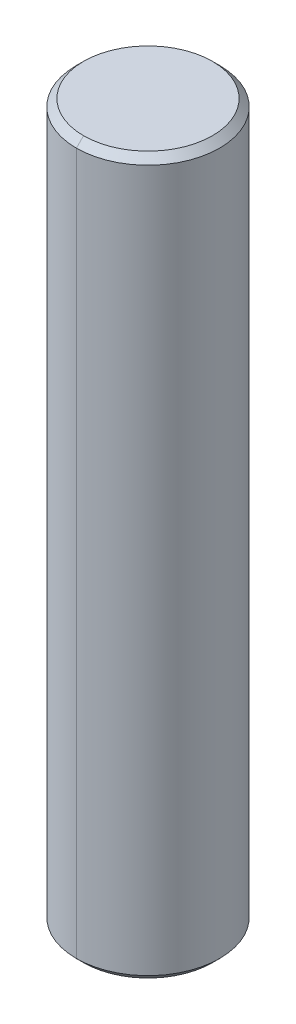
ISO-10303-21;
HEADER;
FILE_DESCRIPTION(('STEP AP214'),'2;1');
FILE_NAME('part.step','',(''),(''),'','','');
FILE_SCHEMA(('AUTOMOTIVE_DESIGN { 1 0 10303 214 1 1 1 1 }'));
ENDSEC;
DATA;
#1=APPLICATION_CONTEXT('core data for automotive mechanical design processes');
#2=APPLICATION_PROTOCOL_DEFINITION('international standard','automotive_design',2000,#1);
#3=PRODUCT_CONTEXT('',#1,'mechanical');
#4=PRODUCT('Part','Part','',(#3));
#5=PRODUCT_RELATED_PRODUCT_CATEGORY('part','',(#4));
#6=PRODUCT_DEFINITION_FORMATION('','',#4);
#7=PRODUCT_DEFINITION_CONTEXT('part definition',#1,'design');
#8=PRODUCT_DEFINITION('design','',#6,#7);
#9=PRODUCT_DEFINITION_SHAPE('','',#8);
#10=(LENGTH_UNIT() NAMED_UNIT(*) SI_UNIT(.MILLI.,.METRE.));
#11=(NAMED_UNIT(*) PLANE_ANGLE_UNIT() SI_UNIT($,.RADIAN.));
#12=(NAMED_UNIT(*) SI_UNIT($,.STERADIAN.) SOLID_ANGLE_UNIT());
#13=UNCERTAINTY_MEASURE_WITH_UNIT(LENGTH_MEASURE(1.E-05),#10,'distance_accuracy_value','');
#14=(GEOMETRIC_REPRESENTATION_CONTEXT(3) GLOBAL_UNCERTAINTY_ASSIGNED_CONTEXT((#13)) GLOBAL_UNIT_ASSIGNED_CONTEXT((#10,
#11,#12)) REPRESENTATION_CONTEXT('',''));
#15=CARTESIAN_POINT('',(0.,0.,0.));
#16=DIRECTION('',(0.,0.,1.));
#17=DIRECTION('',(1.,0.,0.));
#18=AXIS2_PLACEMENT_3D('',#15,#16,#17);
#19=CARTESIAN_POINT('',(0.,0.299999999999994,0.));
#20=DIRECTION('',(0.,1.,0.));
#21=DIRECTION('',(0.,0.,1.));
#22=AXIS2_PLACEMENT_3D('',#19,#20,#21);
#23=CONICAL_SURFACE('',#22,3.,0.78539816339745);
#24=DIRECTION('',(0.,0.707106781186546,-0.707106781186549));
#25=VECTOR('',#24,1.);
#26=CARTESIAN_POINT('',(0.,0.299999999999994,-3.));
#27=LINE('',#26,#25);
#28=CARTESIAN_POINT('',(0.,0.,-2.7));
#29=VERTEX_POINT('',#28);
#30=CARTESIAN_POINT('',(0.,0.299999999999994,-3.));
#31=VERTEX_POINT('',#30);
#32=EDGE_CURVE('E82',#29,#31,#27,.T.);
#33=ORIENTED_EDGE('',*,*,#32,.F.);
#34=CARTESIAN_POINT('',(0.,0.,0.));
#35=DIRECTION('',(0.,-1.,0.));
#36=DIRECTION('',(0.,0.,1.));
#37=AXIS2_PLACEMENT_3D('',#34,#35,#36);
#38=CIRCLE('',#37,2.7);
#39=CARTESIAN_POINT('',(0.,0.,2.7));
#40=VERTEX_POINT('',#39);
#41=EDGE_CURVE('E11',#40,#29,#38,.T.);
#42=ORIENTED_EDGE('',*,*,#41,.F.);
#43=DIRECTION('',(0.,0.707106781186546,0.707106781186549));
#44=VECTOR('',#43,1.);
#45=CARTESIAN_POINT('',(0.,0.299999999999994,3.));
#46=LINE('',#45,#44);
#47=CARTESIAN_POINT('',(0.,0.299999999999994,3.));
#48=VERTEX_POINT('',#47);
#49=EDGE_CURVE('E90',#40,#48,#46,.T.);
#50=ORIENTED_EDGE('',*,*,#49,.T.);
#51=CARTESIAN_POINT('',(0.,0.299999999999994,0.));
#52=DIRECTION('',(0.,1.,0.));
#53=DIRECTION('',(0.,0.,1.));
#54=AXIS2_PLACEMENT_3D('',#51,#52,#53);
#55=CIRCLE('',#54,3.);
#56=EDGE_CURVE('E85',#31,#48,#55,.T.);
#57=ORIENTED_EDGE('',*,*,#56,.F.);
#58=EDGE_LOOP('',(#33,#42,#50,#57));
#59=FACE_BOUND('',#58,.T.);
#60=ADVANCED_FACE('F17',(#59),#23,.T.);
#61=CARTESIAN_POINT('',(0.,30.,0.));
#62=DIRECTION('',(0.,-1.,0.));
#63=DIRECTION('',(0.,0.,-1.));
#64=AXIS2_PLACEMENT_3D('',#61,#62,#63);
#65=CONICAL_SURFACE('',#64,2.7,0.785398163397456);
#66=DIRECTION('',(0.,-0.707106781186542,0.707106781186553));
#67=VECTOR('',#66,1.);
#68=CARTESIAN_POINT('',(0.,30.,2.7));
#69=LINE('',#68,#67);
#70=CARTESIAN_POINT('',(0.,30.,2.7));
#71=VERTEX_POINT('',#70);
#72=CARTESIAN_POINT('',(0.,29.7,3.));
#73=VERTEX_POINT('',#72);
#74=EDGE_CURVE('E104',#71,#73,#69,.T.);
#75=ORIENTED_EDGE('',*,*,#74,.F.);
#76=CARTESIAN_POINT('',(0.,30.,0.));
#77=DIRECTION('',(0.,1.,0.));
#78=DIRECTION('',(0.,0.,1.));
#79=AXIS2_PLACEMENT_3D('',#76,#77,#78);
#80=CIRCLE('',#79,2.7);
#81=CARTESIAN_POINT('',(0.,30.,-2.7));
#82=VERTEX_POINT('',#81);
#83=EDGE_CURVE('E25',#82,#71,#80,.T.);
#84=ORIENTED_EDGE('',*,*,#83,.F.);
#85=DIRECTION('',(0.,-0.707106781186542,-0.707106781186553));
#86=VECTOR('',#85,1.);
#87=CARTESIAN_POINT('',(0.,30.,-2.7));
#88=LINE('',#87,#86);
#89=CARTESIAN_POINT('',(0.,29.7,-3.));
#90=VERTEX_POINT('',#89);
#91=EDGE_CURVE('E114',#82,#90,#88,.T.);
#92=ORIENTED_EDGE('',*,*,#91,.T.);
#93=CARTESIAN_POINT('',(0.,29.7,0.));
#94=DIRECTION('',(0.,-1.,0.));
#95=DIRECTION('',(0.,0.,1.));
#96=AXIS2_PLACEMENT_3D('',#93,#94,#95);
#97=CIRCLE('',#96,3.);
#98=EDGE_CURVE('E36',#73,#90,#97,.T.);
#99=ORIENTED_EDGE('',*,*,#98,.F.);
#100=EDGE_LOOP('',(#75,#84,#92,#99));
#101=FACE_BOUND('',#100,.T.);
#102=ADVANCED_FACE('F218',(#101),#65,.T.);
#103=CARTESIAN_POINT('',(0.,0.,0.));
#104=DIRECTION('',(0.,1.,0.));
#105=DIRECTION('',(1.,0.,0.));
#106=AXIS2_PLACEMENT_3D('',#103,#104,#105);
#107=PLANE('',#106);
#108=ORIENTED_EDGE('',*,*,#41,.T.);
#109=CARTESIAN_POINT('',(0.,0.,0.));
#110=DIRECTION('',(0.,-1.,0.));
#111=DIRECTION('',(0.,0.,1.));
#112=AXIS2_PLACEMENT_3D('',#109,#110,#111);
#113=CIRCLE('',#112,2.7);
#114=EDGE_CURVE('E76',#29,#40,#113,.T.);
#115=ORIENTED_EDGE('',*,*,#114,.T.);
#116=EDGE_LOOP('',(#108,#115));
#117=FACE_BOUND('',#116,.T.);
#118=ADVANCED_FACE('F72',(#117),#107,.F.);
#119=CARTESIAN_POINT('',(0.,30.,0.));
#120=DIRECTION('',(0.,1.,0.));
#121=DIRECTION('',(1.,0.,0.));
#122=AXIS2_PLACEMENT_3D('',#119,#120,#121);
#123=PLANE('',#122);
#124=ORIENTED_EDGE('',*,*,#83,.T.);
#125=CARTESIAN_POINT('',(0.,30.,0.));
#126=DIRECTION('',(0.,1.,0.));
#127=DIRECTION('',(0.,0.,1.));
#128=AXIS2_PLACEMENT_3D('',#125,#126,#127);
#129=CIRCLE('',#128,2.7);
#130=EDGE_CURVE('E102',#71,#82,#129,.T.);
#131=ORIENTED_EDGE('',*,*,#130,.T.);
#132=EDGE_LOOP('',(#124,#131));
#133=FACE_BOUND('',#132,.T.);
#134=ADVANCED_FACE('F201',(#133),#123,.T.);
#135=CARTESIAN_POINT('',(0.,30.,0.));
#136=DIRECTION('',(0.,-1.,0.));
#137=DIRECTION('',(0.,0.,-1.));
#138=AXIS2_PLACEMENT_3D('',#135,#136,#137);
#139=CYLINDRICAL_SURFACE('',#138,3.);
#140=DIRECTION('',(0.,-1.,0.));
#141=VECTOR('',#140,1.);
#142=CARTESIAN_POINT('',(0.,30.,3.));
#143=LINE('',#142,#141);
#144=EDGE_CURVE('E99',#73,#48,#143,.T.);
#145=ORIENTED_EDGE('',*,*,#144,.F.);
#146=ORIENTED_EDGE('',*,*,#98,.T.);
#147=DIRECTION('',(0.,-1.,0.));
#148=VECTOR('',#147,1.);
#149=CARTESIAN_POINT('',(0.,30.,-3.));
#150=LINE('',#149,#148);
#151=EDGE_CURVE('E97',#90,#31,#150,.T.);
#152=ORIENTED_EDGE('',*,*,#151,.T.);
#153=ORIENTED_EDGE('',*,*,#56,.T.);
#154=EDGE_LOOP('',(#145,#146,#152,#153));
#155=FACE_BOUND('',#154,.T.);
#156=ADVANCED_FACE('F122',(#155),#139,.T.);
#157=CARTESIAN_POINT('',(0.,30.,0.));
#158=DIRECTION('',(0.,-1.,0.));
#159=DIRECTION('',(0.,0.,-1.));
#160=AXIS2_PLACEMENT_3D('',#157,#158,#159);
#161=CYLINDRICAL_SURFACE('',#160,3.);
#162=CARTESIAN_POINT('',(0.,29.7,0.));
#163=DIRECTION('',(0.,-1.,0.));
#164=DIRECTION('',(0.,0.,1.));
#165=AXIS2_PLACEMENT_3D('',#162,#163,#164);
#166=CIRCLE('',#165,3.);
#167=EDGE_CURVE('E108',#90,#73,#166,.T.);
#168=ORIENTED_EDGE('',*,*,#167,.T.);
#169=ORIENTED_EDGE('',*,*,#144,.T.);
#170=CARTESIAN_POINT('',(0.,0.299999999999994,0.));
#171=DIRECTION('',(0.,1.,0.));
#172=DIRECTION('',(0.,0.,1.));
#173=AXIS2_PLACEMENT_3D('',#170,#171,#172);
#174=CIRCLE('',#173,3.);
#175=EDGE_CURVE('E88',#48,#31,#174,.T.);
#176=ORIENTED_EDGE('',*,*,#175,.T.);
#177=ORIENTED_EDGE('',*,*,#151,.F.);
#178=EDGE_LOOP('',(#168,#169,#176,#177));
#179=FACE_BOUND('',#178,.T.);
#180=ADVANCED_FACE('F127',(#179),#161,.T.);
#181=CARTESIAN_POINT('',(0.,30.,0.));
#182=DIRECTION('',(0.,-1.,0.));
#183=DIRECTION('',(0.,0.,-1.));
#184=AXIS2_PLACEMENT_3D('',#181,#182,#183);
#185=CONICAL_SURFACE('',#184,2.7,0.785398163397456);
#186=ORIENTED_EDGE('',*,*,#130,.F.);
#187=ORIENTED_EDGE('',*,*,#74,.T.);
#188=ORIENTED_EDGE('',*,*,#167,.F.);
#189=ORIENTED_EDGE('',*,*,#91,.F.);
#190=EDGE_LOOP('',(#186,#187,#188,#189));
#191=FACE_BOUND('',#190,.T.);
#192=ADVANCED_FACE('F177',(#191),#185,.T.);
#193=CARTESIAN_POINT('',(0.,0.299999999999994,0.));
#194=DIRECTION('',(0.,1.,0.));
#195=DIRECTION('',(0.,0.,1.));
#196=AXIS2_PLACEMENT_3D('',#193,#194,#195);
#197=CONICAL_SURFACE('',#196,3.,0.78539816339745);
#198=ORIENTED_EDGE('',*,*,#114,.F.);
#199=ORIENTED_EDGE('',*,*,#32,.T.);
#200=ORIENTED_EDGE('',*,*,#175,.F.);
#201=ORIENTED_EDGE('',*,*,#49,.F.);
#202=EDGE_LOOP('',(#198,#199,#200,#201));
#203=FACE_BOUND('',#202,.T.);
#204=ADVANCED_FACE('F86',(#203),#197,.T.);
#205=CLOSED_SHELL('',(#60,#102,#118,#134,#156,#180,#192,#204));
#206=MANIFOLD_SOLID_BREP('B1',#205);
#207=ADVANCED_BREP_SHAPE_REPRESENTATION('',(#18,#206),#14);
#208=SHAPE_DEFINITION_REPRESENTATION(#9,#207);
ENDSEC;
END-ISO-10303-21;
